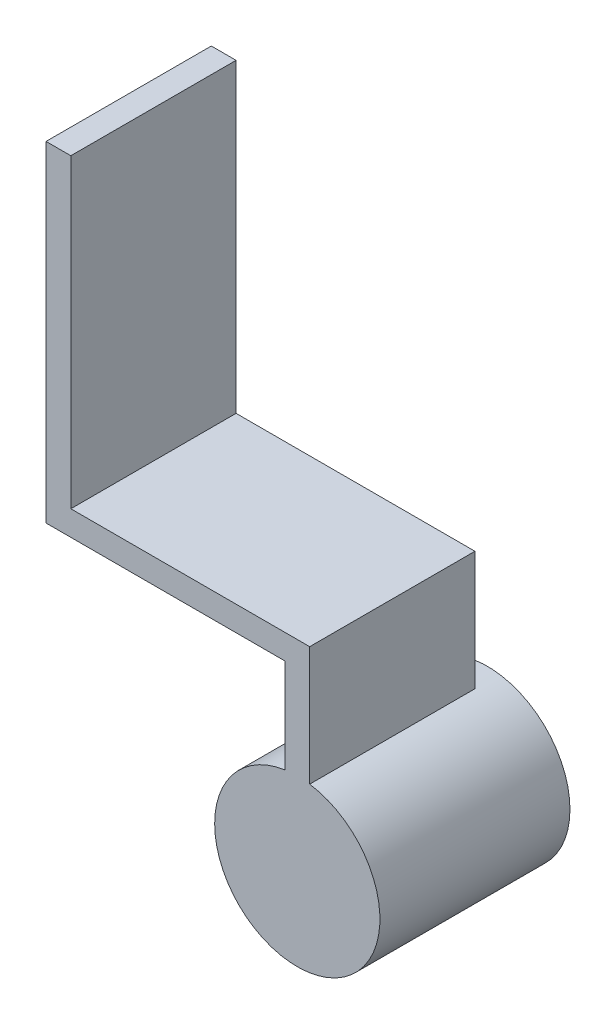
ISO-10303-21;
HEADER;
FILE_DESCRIPTION(('STEP AP214'),'2;1');
FILE_NAME('part.step','',(''),(''),'','','');
FILE_SCHEMA(('AUTOMOTIVE_DESIGN { 1 0 10303 214 1 1 1 1 }'));
ENDSEC;
DATA;
#1=APPLICATION_CONTEXT('core data for automotive mechanical design processes');
#2=APPLICATION_PROTOCOL_DEFINITION('international standard','automotive_design',2000,#1);
#3=PRODUCT_CONTEXT('',#1,'mechanical');
#4=PRODUCT('Part','Part','',(#3));
#5=PRODUCT_RELATED_PRODUCT_CATEGORY('part','',(#4));
#6=PRODUCT_DEFINITION_FORMATION('','',#4);
#7=PRODUCT_DEFINITION_CONTEXT('part definition',#1,'design');
#8=PRODUCT_DEFINITION('design','',#6,#7);
#9=PRODUCT_DEFINITION_SHAPE('','',#8);
#10=(LENGTH_UNIT() NAMED_UNIT(*) SI_UNIT(.MILLI.,.METRE.));
#11=(NAMED_UNIT(*) PLANE_ANGLE_UNIT() SI_UNIT($,.RADIAN.));
#12=(NAMED_UNIT(*) SI_UNIT($,.STERADIAN.) SOLID_ANGLE_UNIT());
#13=UNCERTAINTY_MEASURE_WITH_UNIT(LENGTH_MEASURE(1.E-05),#10,'distance_accuracy_value','');
#14=(GEOMETRIC_REPRESENTATION_CONTEXT(3) GLOBAL_UNCERTAINTY_ASSIGNED_CONTEXT((#13)) GLOBAL_UNIT_ASSIGNED_CONTEXT((#10,
#11,#12)) REPRESENTATION_CONTEXT('',''));
#15=CARTESIAN_POINT('',(0.,0.,0.));
#16=DIRECTION('',(0.,0.,1.));
#17=DIRECTION('',(1.,0.,0.));
#18=AXIS2_PLACEMENT_3D('',#15,#16,#17);
#19=CARTESIAN_POINT('',(-3.,-2.99904794399357,20.));
#20=DIRECTION('',(0.,1.,0.));
#21=DIRECTION('',(-1.,0.,0.));
#22=AXIS2_PLACEMENT_3D('',#19,#20,#21);
#23=PLANE('',#22);
#24=DIRECTION('',(1.,0.,0.));
#25=VECTOR('',#24,1.);
#26=CARTESIAN_POINT('',(-3.,-2.99904794399357,0.));
#27=LINE('',#26,#25);
#28=CARTESIAN_POINT('',(-31.9076229249202,-2.99904794399357,0.));
#29=VERTEX_POINT('',#28);
#30=CARTESIAN_POINT('',(-3.,-2.99904794399357,0.));
#31=VERTEX_POINT('',#30);
#32=EDGE_CURVE('E115',#29,#31,#27,.T.);
#33=ORIENTED_EDGE('',*,*,#32,.T.);
#34=DIRECTION('',(0.,0.,-1.));
#35=VECTOR('',#34,1.);
#36=CARTESIAN_POINT('',(-3.,-2.99904794399357,20.));
#37=LINE('',#36,#35);
#38=CARTESIAN_POINT('',(-3.,-2.99904794399357,20.));
#39=VERTEX_POINT('',#38);
#40=EDGE_CURVE('E42',#39,#31,#37,.T.);
#41=ORIENTED_EDGE('',*,*,#40,.F.);
#42=DIRECTION('',(1.,0.,0.));
#43=VECTOR('',#42,1.);
#44=CARTESIAN_POINT('',(-3.,-2.99904794399357,20.));
#45=LINE('',#44,#43);
#46=CARTESIAN_POINT('',(-31.9076229249202,-2.99904794399357,20.));
#47=VERTEX_POINT('',#46);
#48=EDGE_CURVE('E121',#47,#39,#45,.T.);
#49=ORIENTED_EDGE('',*,*,#48,.F.);
#50=DIRECTION('',(0.,0.,-1.));
#51=VECTOR('',#50,1.);
#52=CARTESIAN_POINT('',(-31.9076229249202,-2.99904794399357,20.));
#53=LINE('',#52,#51);
#54=EDGE_CURVE('E135',#47,#29,#53,.T.);
#55=ORIENTED_EDGE('',*,*,#54,.T.);
#56=EDGE_LOOP('',(#33,#41,#49,#55));
#57=FACE_BOUND('',#56,.T.);
#58=ADVANCED_FACE('F35',(#57),#23,.F.);
#59=CARTESIAN_POINT('',(-3.,-2.99904794399357,20.));
#60=DIRECTION('',(1.,0.,0.));
#61=DIRECTION('',(0.,1.,0.));
#62=AXIS2_PLACEMENT_3D('',#59,#60,#61);
#63=PLANE('',#62);
#64=DIRECTION('',(0.,-1.,0.));
#65=VECTOR('',#64,1.);
#66=CARTESIAN_POINT('',(-3.,-2.99904794399357,0.));
#67=LINE('',#66,#65);
#68=CARTESIAN_POINT('',(-3.,-14.412187977351,0.));
#69=VERTEX_POINT('',#68);
#70=EDGE_CURVE('E105',#31,#69,#67,.T.);
#71=ORIENTED_EDGE('',*,*,#70,.T.);
#72=DIRECTION('',(0.,0.,-1.));
#73=VECTOR('',#72,1.);
#74=CARTESIAN_POINT('',(-3.,-14.412187977351,48.2842712474619));
#75=LINE('',#74,#73);
#76=CARTESIAN_POINT('',(-3.,-14.412187977351,20.));
#77=VERTEX_POINT('',#76);
#78=EDGE_CURVE('E57',#69,#77,#75,.F.);
#79=ORIENTED_EDGE('',*,*,#78,.T.);
#80=DIRECTION('',(0.,-1.,0.));
#81=VECTOR('',#80,1.);
#82=CARTESIAN_POINT('',(-3.,-2.99904794399357,20.));
#83=LINE('',#82,#81);
#84=EDGE_CURVE('E124',#39,#77,#83,.T.);
#85=ORIENTED_EDGE('',*,*,#84,.F.);
#86=ORIENTED_EDGE('',*,*,#40,.T.);
#87=EDGE_LOOP('',(#71,#79,#85,#86));
#88=FACE_BOUND('',#87,.T.);
#89=ADVANCED_FACE('F158',(#88),#63,.F.);
#90=CARTESIAN_POINT('',(0.,0.,20.));
#91=DIRECTION('',(-1.,0.,0.));
#92=DIRECTION('',(0.,-1.,0.));
#93=AXIS2_PLACEMENT_3D('',#90,#91,#92);
#94=PLANE('',#93);
#95=DIRECTION('',(0.,1.,0.));
#96=VECTOR('',#95,1.);
#97=CARTESIAN_POINT('',(0.,0.,20.));
#98=LINE('',#97,#96);
#99=CARTESIAN_POINT('',(0.,-14.412187977351,20.));
#100=VERTEX_POINT('',#99);
#101=CARTESIAN_POINT('',(0.,0.,20.));
#102=VERTEX_POINT('',#101);
#103=EDGE_CURVE('E49',#100,#102,#98,.T.);
#104=ORIENTED_EDGE('',*,*,#103,.F.);
#105=DIRECTION('',(0.,0.,-1.));
#106=VECTOR('',#105,1.);
#107=CARTESIAN_POINT('',(0.,-14.412187977351,48.2842712474619));
#108=LINE('',#107,#106);
#109=CARTESIAN_POINT('',(0.,-14.412187977351,0.));
#110=VERTEX_POINT('',#109);
#111=EDGE_CURVE('E107',#100,#110,#108,.T.);
#112=ORIENTED_EDGE('',*,*,#111,.T.);
#113=DIRECTION('',(0.,1.,0.));
#114=VECTOR('',#113,1.);
#115=CARTESIAN_POINT('',(0.,0.,0.));
#116=LINE('',#115,#114);
#117=CARTESIAN_POINT('',(0.,0.,0.));
#118=VERTEX_POINT('',#117);
#119=EDGE_CURVE('E100',#110,#118,#116,.T.);
#120=ORIENTED_EDGE('',*,*,#119,.T.);
#121=DIRECTION('',(0.,0.,-1.));
#122=VECTOR('',#121,1.);
#123=CARTESIAN_POINT('',(0.,0.,20.));
#124=LINE('',#123,#122);
#125=EDGE_CURVE('E155',#102,#118,#124,.T.);
#126=ORIENTED_EDGE('',*,*,#125,.F.);
#127=EDGE_LOOP('',(#104,#112,#120,#126));
#128=FACE_BOUND('',#127,.T.);
#129=ADVANCED_FACE('F108',(#128),#94,.F.);
#130=CARTESIAN_POINT('',(-28.9076229249202,0.,20.));
#131=DIRECTION('',(0.,-1.,0.));
#132=DIRECTION('',(0.,0.,-1.));
#133=AXIS2_PLACEMENT_3D('',#130,#131,#132);
#134=PLANE('',#133);
#135=DIRECTION('',(-1.,0.,0.));
#136=VECTOR('',#135,1.);
#137=CARTESIAN_POINT('',(-28.9076229249202,0.,0.));
#138=LINE('',#137,#136);
#139=CARTESIAN_POINT('',(-28.9076229249202,0.,0.));
#140=VERTEX_POINT('',#139);
#141=EDGE_CURVE('E103',#118,#140,#138,.T.);
#142=ORIENTED_EDGE('',*,*,#141,.T.);
#143=DIRECTION('',(0.,0.,-1.));
#144=VECTOR('',#143,1.);
#145=CARTESIAN_POINT('',(-28.9076229249202,0.,20.));
#146=LINE('',#145,#144);
#147=CARTESIAN_POINT('',(-28.9076229249202,0.,20.));
#148=VERTEX_POINT('',#147);
#149=EDGE_CURVE('E152',#148,#140,#146,.T.);
#150=ORIENTED_EDGE('',*,*,#149,.F.);
#151=DIRECTION('',(-1.,0.,0.));
#152=VECTOR('',#151,1.);
#153=CARTESIAN_POINT('',(-28.9076229249202,0.,20.));
#154=LINE('',#153,#152);
#155=EDGE_CURVE('E128',#102,#148,#154,.T.);
#156=ORIENTED_EDGE('',*,*,#155,.F.);
#157=ORIENTED_EDGE('',*,*,#125,.T.);
#158=EDGE_LOOP('',(#142,#150,#156,#157));
#159=FACE_BOUND('',#158,.T.);
#160=ADVANCED_FACE('F179',(#159),#134,.F.);
#161=CARTESIAN_POINT('',(-28.9076229249202,0.,20.));
#162=DIRECTION('',(-1.,0.,0.));
#163=DIRECTION('',(0.,0.,1.));
#164=AXIS2_PLACEMENT_3D('',#161,#162,#163);
#165=PLANE('',#164);
#166=DIRECTION('',(0.,1.,0.));
#167=VECTOR('',#166,1.);
#168=CARTESIAN_POINT('',(-28.9076229249202,0.,0.));
#169=LINE('',#168,#167);
#170=CARTESIAN_POINT('',(-28.9076229249202,37.0009520560064,0.));
#171=VERTEX_POINT('',#170);
#172=EDGE_CURVE('E139',#140,#171,#169,.T.);
#173=ORIENTED_EDGE('',*,*,#172,.T.);
#174=DIRECTION('',(0.,0.,-1.));
#175=VECTOR('',#174,1.);
#176=CARTESIAN_POINT('',(-28.9076229249202,37.0009520560064,20.));
#177=LINE('',#176,#175);
#178=CARTESIAN_POINT('',(-28.9076229249202,37.0009520560064,20.));
#179=VERTEX_POINT('',#178);
#180=EDGE_CURVE('E149',#179,#171,#177,.T.);
#181=ORIENTED_EDGE('',*,*,#180,.F.);
#182=DIRECTION('',(0.,1.,0.));
#183=VECTOR('',#182,1.);
#184=CARTESIAN_POINT('',(-28.9076229249202,0.,20.));
#185=LINE('',#184,#183);
#186=EDGE_CURVE('E130',#148,#179,#185,.T.);
#187=ORIENTED_EDGE('',*,*,#186,.F.);
#188=ORIENTED_EDGE('',*,*,#149,.T.);
#189=EDGE_LOOP('',(#173,#181,#187,#188));
#190=FACE_BOUND('',#189,.T.);
#191=ADVANCED_FACE('F175',(#190),#165,.F.);
#192=CARTESIAN_POINT('',(-28.9076229249202,37.0009520560064,20.));
#193=DIRECTION('',(0.,-1.,0.));
#194=DIRECTION('',(0.,0.,-1.));
#195=AXIS2_PLACEMENT_3D('',#192,#193,#194);
#196=PLANE('',#195);
#197=DIRECTION('',(-1.,0.,0.));
#198=VECTOR('',#197,1.);
#199=CARTESIAN_POINT('',(-28.9076229249202,37.0009520560064,0.));
#200=LINE('',#199,#198);
#201=CARTESIAN_POINT('',(-31.9076229249202,37.0009520560064,0.));
#202=VERTEX_POINT('',#201);
#203=EDGE_CURVE('E141',#171,#202,#200,.T.);
#204=ORIENTED_EDGE('',*,*,#203,.T.);
#205=DIRECTION('',(0.,0.,-1.));
#206=VECTOR('',#205,1.);
#207=CARTESIAN_POINT('',(-31.9076229249202,37.0009520560064,20.));
#208=LINE('',#207,#206);
#209=CARTESIAN_POINT('',(-31.9076229249202,37.0009520560064,20.));
#210=VERTEX_POINT('',#209);
#211=EDGE_CURVE('E146',#210,#202,#208,.T.);
#212=ORIENTED_EDGE('',*,*,#211,.F.);
#213=DIRECTION('',(-1.,0.,0.));
#214=VECTOR('',#213,1.);
#215=CARTESIAN_POINT('',(-28.9076229249202,37.0009520560064,20.));
#216=LINE('',#215,#214);
#217=EDGE_CURVE('E132',#179,#210,#216,.T.);
#218=ORIENTED_EDGE('',*,*,#217,.F.);
#219=ORIENTED_EDGE('',*,*,#180,.T.);
#220=EDGE_LOOP('',(#204,#212,#218,#219));
#221=FACE_BOUND('',#220,.T.);
#222=ADVANCED_FACE('F171',(#221),#196,.F.);
#223=CARTESIAN_POINT('',(-31.9076229249202,-2.99904794399357,20.));
#224=DIRECTION('',(1.,0.,0.));
#225=DIRECTION('',(0.,0.,-1.));
#226=AXIS2_PLACEMENT_3D('',#223,#224,#225);
#227=PLANE('',#226);
#228=DIRECTION('',(0.,-1.,0.));
#229=VECTOR('',#228,1.);
#230=CARTESIAN_POINT('',(-31.9076229249202,-2.99904794399357,0.));
#231=LINE('',#230,#229);
#232=EDGE_CURVE('E125',#202,#29,#231,.T.);
#233=ORIENTED_EDGE('',*,*,#232,.T.);
#234=ORIENTED_EDGE('',*,*,#54,.F.);
#235=DIRECTION('',(0.,-1.,0.));
#236=VECTOR('',#235,1.);
#237=CARTESIAN_POINT('',(-31.9076229249202,-2.99904794399357,20.));
#238=LINE('',#237,#236);
#239=EDGE_CURVE('E134',#210,#47,#238,.T.);
#240=ORIENTED_EDGE('',*,*,#239,.F.);
#241=ORIENTED_EDGE('',*,*,#211,.T.);
#242=EDGE_LOOP('',(#233,#234,#240,#241));
#243=FACE_BOUND('',#242,.T.);
#244=ADVANCED_FACE('F166',(#243),#227,.F.);
#245=CARTESIAN_POINT('',(0.,0.,20.));
#246=DIRECTION('',(0.,0.,-1.));
#247=DIRECTION('',(-1.,0.,0.));
#248=AXIS2_PLACEMENT_3D('',#245,#246,#247);
#249=PLANE('',#248);
#250=ORIENTED_EDGE('',*,*,#84,.T.);
#251=CARTESIAN_POINT('',(-1.5,-24.2990479439936,20.));
#252=DIRECTION('',(0.,0.,-1.));
#253=DIRECTION('',(-1.,0.,0.));
#254=AXIS2_PLACEMENT_3D('',#251,#252,#253);
#255=CIRCLE('',#254,10.);
#256=EDGE_CURVE('E112',#77,#100,#255,.F.);
#257=ORIENTED_EDGE('',*,*,#256,.T.);
#258=ORIENTED_EDGE('',*,*,#103,.T.);
#259=ORIENTED_EDGE('',*,*,#155,.T.);
#260=ORIENTED_EDGE('',*,*,#186,.T.);
#261=ORIENTED_EDGE('',*,*,#217,.T.);
#262=ORIENTED_EDGE('',*,*,#239,.T.);
#263=ORIENTED_EDGE('',*,*,#48,.T.);
#264=EDGE_LOOP('',(#250,#257,#258,#259,#260,#261,#262,#263));
#265=FACE_BOUND('',#264,.T.);
#266=ADVANCED_FACE('F181',(#265),#249,.F.);
#267=CARTESIAN_POINT('',(0.,0.,0.));
#268=DIRECTION('',(0.,0.,-1.));
#269=DIRECTION('',(-1.,0.,0.));
#270=AXIS2_PLACEMENT_3D('',#267,#268,#269);
#271=PLANE('',#270);
#272=CARTESIAN_POINT('',(-1.5,-24.2990479439936,0.));
#273=DIRECTION('',(0.,0.,-1.));
#274=DIRECTION('',(-1.,0.,0.));
#275=AXIS2_PLACEMENT_3D('',#272,#273,#274);
#276=CIRCLE('',#275,10.);
#277=EDGE_CURVE('E11',#69,#110,#276,.T.);
#278=ORIENTED_EDGE('',*,*,#277,.F.);
#279=ORIENTED_EDGE('',*,*,#70,.F.);
#280=ORIENTED_EDGE('',*,*,#32,.F.);
#281=ORIENTED_EDGE('',*,*,#232,.F.);
#282=ORIENTED_EDGE('',*,*,#203,.F.);
#283=ORIENTED_EDGE('',*,*,#172,.F.);
#284=ORIENTED_EDGE('',*,*,#141,.F.);
#285=ORIENTED_EDGE('',*,*,#119,.F.);
#286=EDGE_LOOP('',(#278,#279,#280,#281,#282,#283,#284,#285));
#287=FACE_BOUND('',#286,.T.);
#288=ADVANCED_FACE('F101',(#287),#271,.T.);
#289=CARTESIAN_POINT('',(-1.5,-24.2990479439936,48.2842712474619));
#290=DIRECTION('',(0.,0.,-1.));
#291=DIRECTION('',(-1.,0.,0.));
#292=AXIS2_PLACEMENT_3D('',#289,#290,#291);
#293=CYLINDRICAL_SURFACE('',#292,10.);
#294=CARTESIAN_POINT('',(-1.5,-24.2990479439936,-3.));
#295=DIRECTION('',(0.,0.,-1.));
#296=DIRECTION('',(-1.,0.,0.));
#297=AXIS2_PLACEMENT_3D('',#294,#295,#296);
#298=CIRCLE('',#297,10.);
#299=CARTESIAN_POINT('',(-11.5,-24.2990479439936,-3.));
#300=VERTEX_POINT('',#299);
#301=EDGE_CURVE('E182',#300,#300,#298,.T.);
#302=ORIENTED_EDGE('',*,*,#301,.F.);
#303=EDGE_LOOP('',(#302));
#304=FACE_BOUND('',#303,.T.);
#305=ORIENTED_EDGE('',*,*,#78,.F.);
#306=ORIENTED_EDGE('',*,*,#277,.T.);
#307=ORIENTED_EDGE('',*,*,#111,.F.);
#308=ORIENTED_EDGE('',*,*,#256,.F.);
#309=EDGE_LOOP('',(#305,#306,#307,#308));
#310=FACE_BOUND('',#309,.T.);
#311=ADVANCED_FACE('F114',(#304,#310),#293,.T.);
#312=CARTESIAN_POINT('',(-1.5,-24.2990479439936,-3.));
#313=DIRECTION('',(0.,0.,-1.));
#314=DIRECTION('',(-1.,0.,0.));
#315=AXIS2_PLACEMENT_3D('',#312,#313,#314);
#316=PLANE('',#315);
#317=ORIENTED_EDGE('',*,*,#301,.T.);
#318=EDGE_LOOP('',(#317));
#319=FACE_BOUND('',#318,.T.);
#320=ADVANCED_FACE('F187',(#319),#316,.T.);
#321=CLOSED_SHELL('',(#58,#89,#129,#160,#191,#222,#244,#266,#288,#311,#320));
#322=MANIFOLD_SOLID_BREP('B2',#321);
#323=ADVANCED_BREP_SHAPE_REPRESENTATION('',(#18,#322),#14);
#324=SHAPE_DEFINITION_REPRESENTATION(#9,#323);
ENDSEC;
END-ISO-10303-21;
